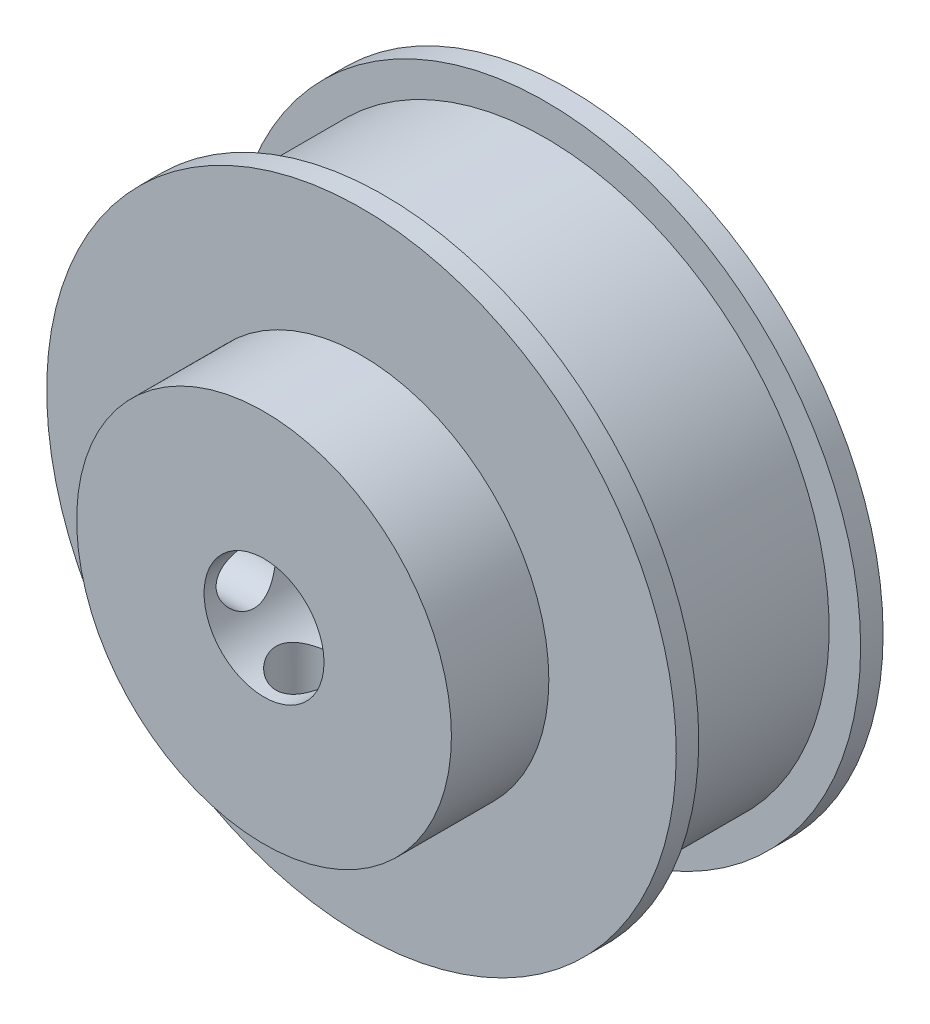
ISO-10303-21;
HEADER;
FILE_DESCRIPTION(('STEP AP214'),'2;1');
FILE_NAME('part.step','',(''),(''),'','','');
FILE_SCHEMA(('AUTOMOTIVE_DESIGN { 1 0 10303 214 1 1 1 1 }'));
ENDSEC;
DATA;
#1=APPLICATION_CONTEXT('core data for automotive mechanical design processes');
#2=APPLICATION_PROTOCOL_DEFINITION('international standard','automotive_design',2000,#1);
#3=PRODUCT_CONTEXT('',#1,'mechanical');
#4=PRODUCT('Part','Part','',(#3));
#5=PRODUCT_RELATED_PRODUCT_CATEGORY('part','',(#4));
#6=PRODUCT_DEFINITION_FORMATION('','',#4);
#7=PRODUCT_DEFINITION_CONTEXT('part definition',#1,'design');
#8=PRODUCT_DEFINITION('design','',#6,#7);
#9=PRODUCT_DEFINITION_SHAPE('','',#8);
#10=(LENGTH_UNIT() NAMED_UNIT(*) SI_UNIT(.MILLI.,.METRE.));
#11=(NAMED_UNIT(*) PLANE_ANGLE_UNIT() SI_UNIT($,.RADIAN.));
#12=(NAMED_UNIT(*) SI_UNIT($,.STERADIAN.) SOLID_ANGLE_UNIT());
#13=UNCERTAINTY_MEASURE_WITH_UNIT(LENGTH_MEASURE(1.E-05),#10,'distance_accuracy_value','');
#14=(GEOMETRIC_REPRESENTATION_CONTEXT(3) GLOBAL_UNCERTAINTY_ASSIGNED_CONTEXT((#13)) GLOBAL_UNIT_ASSIGNED_CONTEXT((#10,
#11,#12)) REPRESENTATION_CONTEXT('',''));
#15=CARTESIAN_POINT('',(0.,0.,0.));
#16=DIRECTION('',(0.,0.,1.));
#17=DIRECTION('',(1.,0.,0.));
#18=AXIS2_PLACEMENT_3D('',#15,#16,#17);
#19=CARTESIAN_POINT('',(0.,0.,13.8));
#20=DIRECTION('',(0.,0.,1.));
#21=DIRECTION('',(1.,0.,0.));
#22=AXIS2_PLACEMENT_3D('',#19,#20,#21);
#23=PLANE('',#22);
#24=CARTESIAN_POINT('',(0.,0.,13.8));
#25=DIRECTION('',(0.,0.,1.));
#26=DIRECTION('',(1.,0.,0.));
#27=AXIS2_PLACEMENT_3D('',#24,#25,#26);
#28=CIRCLE('',#27,21.);
#29=CARTESIAN_POINT('',(21.,0.,13.8));
#30=VERTEX_POINT('',#29);
#31=EDGE_CURVE('E144',#30,#30,#28,.T.);
#32=ORIENTED_EDGE('',*,*,#31,.T.);
#33=EDGE_LOOP('',(#32));
#34=FACE_BOUND('',#33,.T.);
#35=CARTESIAN_POINT('',(0.,0.,13.8));
#36=DIRECTION('',(0.,0.,1.));
#37=DIRECTION('',(1.,0.,0.));
#38=AXIS2_PLACEMENT_3D('',#35,#36,#37);
#39=CIRCLE('',#38,12.5);
#40=CARTESIAN_POINT('',(12.5,0.,13.8));
#41=VERTEX_POINT('',#40);
#42=EDGE_CURVE('E59',#41,#41,#39,.T.);
#43=ORIENTED_EDGE('',*,*,#42,.F.);
#44=EDGE_LOOP('',(#43));
#45=FACE_BOUND('',#44,.T.);
#46=ADVANCED_FACE('F31',(#34,#45),#23,.T.);
#47=CARTESIAN_POINT('',(0.,0.,1.5));
#48=DIRECTION('',(0.,0.,1.));
#49=DIRECTION('',(1.,0.,0.));
#50=AXIS2_PLACEMENT_3D('',#47,#48,#49);
#51=PLANE('',#50);
#52=CARTESIAN_POINT('',(0.,0.,1.5));
#53=DIRECTION('',(0.,0.,1.));
#54=DIRECTION('',(1.,0.,0.));
#55=AXIS2_PLACEMENT_3D('',#52,#53,#54);
#56=CIRCLE('',#55,21.);
#57=CARTESIAN_POINT('',(21.,0.,1.5));
#58=VERTEX_POINT('',#57);
#59=EDGE_CURVE('E10',#58,#58,#56,.T.);
#60=ORIENTED_EDGE('',*,*,#59,.T.);
#61=EDGE_LOOP('',(#60));
#62=FACE_BOUND('',#61,.T.);
#63=CARTESIAN_POINT('',(0.,0.,1.5));
#64=DIRECTION('',(0.,0.,1.));
#65=DIRECTION('',(1.,0.,0.));
#66=AXIS2_PLACEMENT_3D('',#63,#64,#65);
#67=CIRCLE('',#66,18.9);
#68=CARTESIAN_POINT('',(-18.9,0.,1.5));
#69=VERTEX_POINT('',#68);
#70=EDGE_CURVE('E51',#69,#69,#67,.T.);
#71=ORIENTED_EDGE('',*,*,#70,.F.);
#72=EDGE_LOOP('',(#71));
#73=FACE_BOUND('',#72,.T.);
#74=ADVANCED_FACE('F97',(#62,#73),#51,.T.);
#75=CARTESIAN_POINT('',(0.,0.,1.5));
#76=DIRECTION('',(0.,0.,-1.));
#77=DIRECTION('',(-1.,0.,0.));
#78=AXIS2_PLACEMENT_3D('',#75,#76,#77);
#79=CYLINDRICAL_SURFACE('',#78,21.);
#80=ORIENTED_EDGE('',*,*,#59,.F.);
#81=EDGE_LOOP('',(#80));
#82=FACE_BOUND('',#81,.T.);
#83=CARTESIAN_POINT('',(0.,0.,0.));
#84=DIRECTION('',(0.,0.,1.));
#85=DIRECTION('',(1.,0.,0.));
#86=AXIS2_PLACEMENT_3D('',#83,#84,#85);
#87=CIRCLE('',#86,21.);
#88=CARTESIAN_POINT('',(21.,0.,0.));
#89=VERTEX_POINT('',#88);
#90=EDGE_CURVE('E43',#89,#89,#87,.T.);
#91=ORIENTED_EDGE('',*,*,#90,.T.);
#92=EDGE_LOOP('',(#91));
#93=FACE_BOUND('',#92,.T.);
#94=ADVANCED_FACE('F33',(#82,#93),#79,.T.);
#95=CARTESIAN_POINT('',(0.,0.,0.));
#96=DIRECTION('',(0.,0.,1.));
#97=DIRECTION('',(1.,0.,0.));
#98=AXIS2_PLACEMENT_3D('',#95,#96,#97);
#99=PLANE('',#98);
#100=CARTESIAN_POINT('',(0.,0.,0.));
#101=DIRECTION('',(0.,0.,1.));
#102=DIRECTION('',(1.,0.,0.));
#103=AXIS2_PLACEMENT_3D('',#100,#101,#102);
#104=CIRCLE('',#103,4.);
#105=CARTESIAN_POINT('',(4.,0.,0.));
#106=VERTEX_POINT('',#105);
#107=EDGE_CURVE('E127',#106,#106,#104,.T.);
#108=ORIENTED_EDGE('',*,*,#107,.T.);
#109=EDGE_LOOP('',(#108));
#110=FACE_BOUND('',#109,.T.);
#111=ORIENTED_EDGE('',*,*,#90,.F.);
#112=EDGE_LOOP('',(#111));
#113=FACE_BOUND('',#112,.T.);
#114=ADVANCED_FACE('F116',(#110,#113),#99,.F.);
#115=CARTESIAN_POINT('',(0.,0.,12.3));
#116=DIRECTION('',(0.,0.,-1.));
#117=DIRECTION('',(-1.,0.,0.));
#118=AXIS2_PLACEMENT_3D('',#115,#116,#117);
#119=CYLINDRICAL_SURFACE('',#118,18.9);
#120=CARTESIAN_POINT('',(0.,0.,12.3));
#121=DIRECTION('',(0.,0.,1.));
#122=DIRECTION('',(1.,0.,0.));
#123=AXIS2_PLACEMENT_3D('',#120,#121,#122);
#124=CIRCLE('',#123,18.9);
#125=CARTESIAN_POINT('',(-18.9,0.,12.3));
#126=VERTEX_POINT('',#125);
#127=EDGE_CURVE('E48',#126,#126,#124,.T.);
#128=CARTESIAN_POINT('',(-18.9,0.,12.3));
#129=CARTESIAN_POINT('',(-18.9,0.,12.1875));
#130=CARTESIAN_POINT('',(-18.9,0.,12.075));
#131=CARTESIAN_POINT('',(-18.9,0.,11.85));
#132=CARTESIAN_POINT('',(-18.9,0.,11.7375));
#133=CARTESIAN_POINT('',(-18.9,0.,11.5125));
#134=CARTESIAN_POINT('',(-18.9,0.,11.4));
#135=CARTESIAN_POINT('',(-18.9,0.,11.175));
#136=CARTESIAN_POINT('',(-18.9,0.,11.0625));
#137=CARTESIAN_POINT('',(-18.9,0.,10.8375));
#138=CARTESIAN_POINT('',(-18.9,0.,10.725));
#139=CARTESIAN_POINT('',(-18.9,0.,10.5));
#140=CARTESIAN_POINT('',(-18.9,0.,10.3875));
#141=CARTESIAN_POINT('',(-18.9,0.,10.1625));
#142=CARTESIAN_POINT('',(-18.9,0.,10.05));
#143=CARTESIAN_POINT('',(-18.9,0.,9.825));
#144=CARTESIAN_POINT('',(-18.9,0.,9.7125));
#145=CARTESIAN_POINT('',(-18.9,0.,9.4875));
#146=CARTESIAN_POINT('',(-18.9,0.,9.375));
#147=CARTESIAN_POINT('',(-18.9,0.,9.15));
#148=CARTESIAN_POINT('',(-18.9,0.,9.0375));
#149=CARTESIAN_POINT('',(-18.9,0.,8.8125));
#150=CARTESIAN_POINT('',(-18.9,0.,8.7));
#151=CARTESIAN_POINT('',(-18.9,0.,8.475));
#152=CARTESIAN_POINT('',(-18.9,0.,8.3625));
#153=CARTESIAN_POINT('',(-18.9,0.,8.1375));
#154=CARTESIAN_POINT('',(-18.9,0.,8.025));
#155=CARTESIAN_POINT('',(-18.9,0.,7.8));
#156=CARTESIAN_POINT('',(-18.9,0.,7.6875));
#157=CARTESIAN_POINT('',(-18.9,0.,7.4625));
#158=CARTESIAN_POINT('',(-18.9,0.,7.35));
#159=CARTESIAN_POINT('',(-18.9,0.,7.125));
#160=CARTESIAN_POINT('',(-18.9,0.,7.0125));
#161=CARTESIAN_POINT('',(-18.9,0.,6.7875));
#162=CARTESIAN_POINT('',(-18.9,0.,6.675));
#163=CARTESIAN_POINT('',(-18.9,0.,6.45));
#164=CARTESIAN_POINT('',(-18.9,0.,6.3375));
#165=CARTESIAN_POINT('',(-18.9,0.,6.1125));
#166=CARTESIAN_POINT('',(-18.9,0.,6.));
#167=CARTESIAN_POINT('',(-18.9,0.,5.775));
#168=CARTESIAN_POINT('',(-18.9,0.,5.6625));
#169=CARTESIAN_POINT('',(-18.9,0.,5.4375));
#170=CARTESIAN_POINT('',(-18.9,0.,5.325));
#171=CARTESIAN_POINT('',(-18.9,0.,5.1));
#172=CARTESIAN_POINT('',(-18.9,0.,4.9875));
#173=CARTESIAN_POINT('',(-18.9,0.,4.7625));
#174=CARTESIAN_POINT('',(-18.9,0.,4.65));
#175=CARTESIAN_POINT('',(-18.9,0.,4.425));
#176=CARTESIAN_POINT('',(-18.9,0.,4.3125));
#177=CARTESIAN_POINT('',(-18.9,0.,4.0875));
#178=CARTESIAN_POINT('',(-18.9,0.,3.975));
#179=CARTESIAN_POINT('',(-18.9,0.,3.75));
#180=CARTESIAN_POINT('',(-18.9,0.,3.6375));
#181=CARTESIAN_POINT('',(-18.9,0.,3.4125));
#182=CARTESIAN_POINT('',(-18.9,0.,3.3));
#183=CARTESIAN_POINT('',(-18.9,0.,3.075));
#184=CARTESIAN_POINT('',(-18.9,0.,2.9625));
#185=CARTESIAN_POINT('',(-18.9,0.,2.7375));
#186=CARTESIAN_POINT('',(-18.9,0.,2.625));
#187=CARTESIAN_POINT('',(-18.9,0.,2.4));
#188=CARTESIAN_POINT('',(-18.9,0.,2.2875));
#189=CARTESIAN_POINT('',(-18.9,0.,2.0625));
#190=CARTESIAN_POINT('',(-18.9,0.,1.95));
#191=CARTESIAN_POINT('',(-18.9,0.,1.725));
#192=CARTESIAN_POINT('',(-18.9,0.,1.6125));
#193=CARTESIAN_POINT('',(-18.9,0.,1.5));
#194=B_SPLINE_CURVE_WITH_KNOTS('',3,(#128,#129,#130,#131,#132,#133,#134,#135,#136,#137,#138,
#139,#140,#141,#142,#143,#144,#145,#146,#147,#148,#149,#150,#151,#152,#153,#154,#155,#156,#157,
#158,#159,#160,#161,#162,#163,#164,#165,#166,#167,#168,#169,#170,#171,#172,#173,#174,#175,#176,
#177,#178,#179,#180,#181,#182,#183,#184,#185,#186,#187,#188,#189,#190,#191,#192,#193),
.UNSPECIFIED.,.F.,.F.,(4,2,2,2,2,2,2,2,2,2,2,2,2,2,2,2,2,2,2,2,2,2,2,2,2,2,2,2,2,2,2,2,4),(0.,
0.337500000000001,0.675,1.0125,1.35,1.6875,2.025,2.3625,2.7,3.0375,3.375,3.7125,4.05,4.3875,
4.725,5.0625,5.4,5.7375,6.075,6.4125,6.75,7.0875,7.425,7.7625,8.1,8.4375,8.775,9.1125,9.45,
9.7875,10.125,10.4625,10.8),.UNSPECIFIED.);
#195=EDGE_CURVE('BSEAM110',#126,#69,#194,.T.);
#196=ORIENTED_EDGE('',*,*,#127,.F.);
#197=ORIENTED_EDGE('',*,*,#70,.T.);
#198=ORIENTED_EDGE('',*,*,#195,.T.);
#199=ORIENTED_EDGE('',*,*,#195,.F.);
#200=EDGE_LOOP('',(#196,#198,#197,#199));
#201=FACE_BOUND('',#200,.T.);
#202=ADVANCED_FACE('F110',(#201),#119,.T.);
#203=CARTESIAN_POINT('',(0.,0.,12.3));
#204=DIRECTION('',(0.,0.,1.));
#205=DIRECTION('',(1.,0.,0.));
#206=AXIS2_PLACEMENT_3D('',#203,#204,#205);
#207=PLANE('',#206);
#208=CARTESIAN_POINT('',(0.,0.,12.3));
#209=DIRECTION('',(0.,0.,1.));
#210=DIRECTION('',(1.,0.,0.));
#211=AXIS2_PLACEMENT_3D('',#208,#209,#210);
#212=CIRCLE('',#211,21.);
#213=CARTESIAN_POINT('',(21.,0.,12.3));
#214=VERTEX_POINT('',#213);
#215=EDGE_CURVE('E142',#214,#214,#212,.T.);
#216=ORIENTED_EDGE('',*,*,#215,.F.);
#217=EDGE_LOOP('',(#216));
#218=FACE_BOUND('',#217,.T.);
#219=ORIENTED_EDGE('',*,*,#127,.T.);
#220=EDGE_LOOP('',(#219));
#221=FACE_BOUND('',#220,.T.);
#222=ADVANCED_FACE('F106',(#218,#221),#207,.F.);
#223=CARTESIAN_POINT('',(0.,0.,13.8));
#224=DIRECTION('',(0.,0.,-1.));
#225=DIRECTION('',(-1.,0.,0.));
#226=AXIS2_PLACEMENT_3D('',#223,#224,#225);
#227=CYLINDRICAL_SURFACE('',#226,21.);
#228=ORIENTED_EDGE('',*,*,#31,.F.);
#229=EDGE_LOOP('',(#228));
#230=FACE_BOUND('',#229,.T.);
#231=ORIENTED_EDGE('',*,*,#215,.T.);
#232=EDGE_LOOP('',(#231));
#233=FACE_BOUND('',#232,.T.);
#234=ADVANCED_FACE('F109',(#230,#233),#227,.T.);
#235=CARTESIAN_POINT('',(0.,0.,20.3));
#236=DIRECTION('',(0.,0.,-1.));
#237=DIRECTION('',(-1.,0.,0.));
#238=AXIS2_PLACEMENT_3D('',#235,#236,#237);
#239=CYLINDRICAL_SURFACE('',#238,12.5);
#240=CARTESIAN_POINT('',(-12.5,0.,19.5));
#241=CARTESIAN_POINT('',(-12.4999981342099,-0.111577020127934,19.4999954713698));
#242=CARTESIAN_POINT('',(-12.4984904676373,-0.223216523860334,19.4906313927068));
#243=CARTESIAN_POINT('',(-12.4926212341856,-0.443368779658238,19.453435552302));
#244=CARTESIAN_POINT('',(-12.4882569793104,-0.551878486135173,19.4255863960999));
#245=CARTESIAN_POINT('',(-12.4771644640129,-0.762553771126289,19.352279119554));
#246=CARTESIAN_POINT('',(-12.4704380773984,-0.864724302944008,19.3068349538792));
#247=CARTESIAN_POINT('',(-12.4553623980115,-1.05997584434547,19.1996632056022));
#248=CARTESIAN_POINT('',(-12.4470133072085,-1.15305798294893,19.1379376491164));
#249=CARTESIAN_POINT('',(-12.4295364290338,-1.32832749604674,18.9993743957376));
#250=CARTESIAN_POINT('',(-12.4204030044304,-1.41042286652597,18.9224210210548));
#251=CARTESIAN_POINT('',(-12.4024303990938,-1.56059410283783,18.755835532725));
#252=CARTESIAN_POINT('',(-12.393591236265,-1.62866911690709,18.6662026493313));
#253=CARTESIAN_POINT('',(-12.377153335782,-1.74923165413214,18.4761761138479));
#254=CARTESIAN_POINT('',(-12.369561883485,-1.80162899846097,18.3757245626384));
#255=CARTESIAN_POINT('',(-12.3565566594955,-1.88877230962607,18.1673043371312));
#256=CARTESIAN_POINT('',(-12.3511427525034,-1.92351937318009,18.0593361303625));
#257=CARTESIAN_POINT('',(-12.3431614474236,-1.97408758681328,17.8399196231352));
#258=CARTESIAN_POINT('',(-12.3405702530036,-1.990067044504,17.72850868905));
#259=CARTESIAN_POINT('',(-12.3384556715911,-2.00313711337577,17.5045590129146));
#260=CARTESIAN_POINT('',(-12.3389320844424,-2.00022895694193,17.3920203449255));
#261=CARTESIAN_POINT('',(-12.3428771480604,-1.97573547058135,17.1701349695011));
#262=CARTESIAN_POINT('',(-12.3463174079177,-1.95432734726415,17.060768122639));
#263=CARTESIAN_POINT('',(-12.3557581320174,-1.89371943513841,16.847198928902));
#264=CARTESIAN_POINT('',(-12.36175867776,-1.85451907995672,16.7429967465491));
#265=CARTESIAN_POINT('',(-12.375674818266,-1.75925788747207,16.5421807321441));
#266=CARTESIAN_POINT('',(-12.3835988093069,-1.7031228581751,16.4456027003146));
#267=CARTESIAN_POINT('',(-12.4004630811492,-1.57563852632363,16.2631697283147));
#268=CARTESIAN_POINT('',(-12.4094034376511,-1.50428809015537,16.1773155878768));
#269=CARTESIAN_POINT('',(-12.4274181245254,-1.34742984087892,16.0177411995627));
#270=CARTESIAN_POINT('',(-12.4364928200271,-1.26176985545599,15.9441704929312));
#271=CARTESIAN_POINT('',(-12.4536592708467,-1.07924037468053,15.812425261157));
#272=CARTESIAN_POINT('',(-12.4617510207175,-0.982370817216383,15.7542508213299));
#273=CARTESIAN_POINT('',(-12.4760500569944,-0.780035888309123,15.654938321886));
#274=CARTESIAN_POINT('',(-12.4822559575706,-0.674564267421534,15.6138127827311));
#275=CARTESIAN_POINT('',(-12.492072755936,-0.458089833939773,15.549900642074));
#276=CARTESIAN_POINT('',(-12.4956838535962,-0.347087448070732,15.5271126280629));
#277=CARTESIAN_POINT('',(-12.4998774645506,-0.123992055401972,15.500723529987));
#278=CARTESIAN_POINT('',(-12.5004923996757,-0.0119239336604407,15.4969170340423));
#279=CARTESIAN_POINT('',(-12.4987129750933,0.21124937151114,15.5080523816093));
#280=CARTESIAN_POINT('',(-12.4963187218055,0.322354588854285,15.5229935621113));
#281=CARTESIAN_POINT('',(-12.4888100015234,0.539818798235505,15.5710292981892));
#282=CARTESIAN_POINT('',(-12.4837106780256,0.646200674402081,15.6040228253046));
#283=CARTESIAN_POINT('',(-12.4713614614776,0.851922990585993,15.6871194685301));
#284=CARTESIAN_POINT('',(-12.4641114556453,0.95126306099119,15.7372234819381));
#285=CARTESIAN_POINT('',(-12.4481852151843,1.14097865112887,15.8535939993033));
#286=CARTESIAN_POINT('',(-12.4394977755831,1.2312740030957,15.9199896360231));
#287=CARTESIAN_POINT('',(-12.4216959541371,1.39951415639528,16.0668801543625));
#288=CARTESIAN_POINT('',(-12.4125815438834,1.47745813440283,16.1473759751283));
#289=CARTESIAN_POINT('',(-12.3948490273074,1.6195386653,16.321100388104));
#290=CARTESIAN_POINT('',(-12.3862364645378,1.6835368741472,16.4144427787868));
#291=CARTESIAN_POINT('',(-12.3705841030174,1.79494489210119,16.6106737811203));
#292=CARTESIAN_POINT('',(-12.3635442573346,1.84235519623835,16.7135621077771));
#293=CARTESIAN_POINT('',(-12.3518754120478,1.91903158354154,16.9255669592182));
#294=CARTESIAN_POINT('',(-12.3472370587722,1.94836814902516,17.0346574545979));
#295=CARTESIAN_POINT('',(-12.3408723222072,1.98828718554459,17.256297569992));
#296=CARTESIAN_POINT('',(-12.3391457074239,1.99887114748454,17.3688469142908));
#297=CARTESIAN_POINT('',(-12.3388093758569,2.00094546618394,17.5928294934366));
#298=CARTESIAN_POINT('',(-12.3401641282165,1.99265347821446,17.7042607195398));
#299=CARTESIAN_POINT('',(-12.3457602825821,1.95768017972975,17.9241213226272));
#300=CARTESIAN_POINT('',(-12.3500016772787,1.93099891577862,18.0325507072119));
#301=CARTESIAN_POINT('',(-12.3608801586201,1.86008521855063,18.2432553500165));
#302=CARTESIAN_POINT('',(-12.3675148843103,1.81587007770133,18.3455365576413));
#303=CARTESIAN_POINT('',(-12.3824349767408,1.71116577284244,18.5412644676731));
#304=CARTESIAN_POINT('',(-12.3907204147391,1.65067590624507,18.6347107884382));
#305=CARTESIAN_POINT('',(-12.4081216807701,1.51435663599677,18.8112185808365));
#306=CARTESIAN_POINT('',(-12.417245602178,1.43836664580959,18.8941552479004));
#307=CARTESIAN_POINT('',(-12.4352300129975,1.27354334357952,19.0461753813975));
#308=CARTESIAN_POINT('',(-12.44409044097,1.18470706402004,19.1152556381487));
#309=CARTESIAN_POINT('',(-12.4606140562915,0.99604834657733,19.2379974661718));
#310=CARTESIAN_POINT('',(-12.4682693265296,0.896160049794844,19.2915588738874));
#311=CARTESIAN_POINT('',(-12.4814428750468,0.688725166968653,19.3810612928991));
#312=CARTESIAN_POINT('',(-12.4869633156233,0.581186461209752,19.417020143104));
#313=CARTESIAN_POINT('',(-12.4940175589639,0.394335518838039,19.4623457387355));
#314=CARTESIAN_POINT('',(-12.4962491778317,0.316163477498691,19.4764439027928));
#315=CARTESIAN_POINT('',(-12.4992410506714,0.158671480151703,19.4952725728636));
#316=CARTESIAN_POINT('',(-12.5000013269159,0.0793515415388271,19.5000032206792));
#317=CARTESIAN_POINT('',(-12.5,0.,19.5));
#318=B_SPLINE_CURVE_WITH_KNOTS('',3,(#240,#241,#242,#243,#244,#245,#246,#247,#248,#249,#250,
#251,#252,#253,#254,#255,#256,#257,#258,#259,#260,#261,#262,#263,#264,#265,#266,#267,#268,#269,
#270,#271,#272,#273,#274,#275,#276,#277,#278,#279,#280,#281,#282,#283,#284,#285,#286,#287,#288,
#289,#290,#291,#292,#293,#294,#295,#296,#297,#298,#299,#300,#301,#302,#303,#304,#305,#306,#307,
#308,#309,#310,#311,#312,#313,#314,#315,#316,#317),.UNSPECIFIED.,.T.,.F.,(4,2,2,2,2,2,2,2,2,2,2,
2,2,2,2,2,2,2,2,2,2,2,2,2,2,2,2,2,2,2,2,2,2,2,2,2,2,2,4),(0.,0.334441046622945,
0.669197249319467,1.00368849765686,1.33813814029104,1.67523334608234,2.0123490250128,
2.35136809625946,2.69036609964137,3.0264835846965,3.36257913887026,3.695490558905,
4.02841257712192,4.36281487068318,4.69724208737484,5.03548313337389,5.37372605363721,
5.71221693636019,6.05068174320194,6.38547572150114,6.72025786018134,7.05318530227048,
7.38613020622256,7.72180459283845,8.0575013456327,8.39639027086604,8.73526908182521,
9.07281785760314,9.41033979575026,9.74398956846141,10.0776384963298,10.4109591848676,
10.7442942653298,11.0812763085405,11.4183363199473,11.7575256865024,12.0963705940352,
12.3342225666998,12.5720709388195),.UNSPECIFIED.);
#319=CARTESIAN_POINT('',(-12.5,0.,19.5));
#320=VERTEX_POINT('',#319);
#321=EDGE_CURVE('E60',#320,#320,#318,.T.);
#322=ORIENTED_EDGE('',*,*,#321,.T.);
#323=EDGE_LOOP('',(#322));
#324=FACE_BOUND('',#323,.T.);
#325=CARTESIAN_POINT('',(0.,-12.5,19.5));
#326=CARTESIAN_POINT('',(0.111577020127936,-12.4999981342099,19.4999954713698));
#327=CARTESIAN_POINT('',(0.223216523860337,-12.4984904676373,19.4906313927068));
#328=CARTESIAN_POINT('',(0.443368779658241,-12.4926212341856,19.453435552302));
#329=CARTESIAN_POINT('',(0.551878486135176,-12.4882569793104,19.4255863960999));
#330=CARTESIAN_POINT('',(0.762553771126291,-12.4771644640129,19.352279119554));
#331=CARTESIAN_POINT('',(0.86472430294401,-12.4704380773984,19.3068349538792));
#332=CARTESIAN_POINT('',(1.05997584434547,-12.4553623980115,19.1996632056022));
#333=CARTESIAN_POINT('',(1.15305798294894,-12.4470133072085,19.1379376491164));
#334=CARTESIAN_POINT('',(1.32832749604675,-12.4295364290338,18.9993743957376));
#335=CARTESIAN_POINT('',(1.41042286652597,-12.4204030044304,18.9224210210548));
#336=CARTESIAN_POINT('',(1.56059410283783,-12.4024303990938,18.755835532725));
#337=CARTESIAN_POINT('',(1.62866911690709,-12.393591236265,18.6662026493313));
#338=CARTESIAN_POINT('',(1.74923165413214,-12.377153335782,18.4761761138479));
#339=CARTESIAN_POINT('',(1.80162899846097,-12.369561883485,18.3757245626384));
#340=CARTESIAN_POINT('',(1.88877230962607,-12.3565566594955,18.1673043371312));
#341=CARTESIAN_POINT('',(1.92351937318009,-12.3511427525034,18.0593361303625));
#342=CARTESIAN_POINT('',(1.97408758681328,-12.3431614474236,17.8399196231352));
#343=CARTESIAN_POINT('',(1.99006704450401,-12.3405702530036,17.72850868905));
#344=CARTESIAN_POINT('',(2.00313711337577,-12.3384556715911,17.5045590129146));
#345=CARTESIAN_POINT('',(2.00022895694193,-12.3389320844424,17.3920203449255));
#346=CARTESIAN_POINT('',(1.97573547058135,-12.3428771480604,17.1701349695011));
#347=CARTESIAN_POINT('',(1.95432734726415,-12.3463174079177,17.060768122639));
#348=CARTESIAN_POINT('',(1.89371943513841,-12.3557581320174,16.847198928902));
#349=CARTESIAN_POINT('',(1.85451907995672,-12.36175867776,16.7429967465491));
#350=CARTESIAN_POINT('',(1.75925788747207,-12.375674818266,16.5421807321441));
#351=CARTESIAN_POINT('',(1.7031228581751,-12.3835988093069,16.4456027003146));
#352=CARTESIAN_POINT('',(1.57563852632363,-12.4004630811492,16.2631697283147));
#353=CARTESIAN_POINT('',(1.50428809015537,-12.4094034376511,16.1773155878768));
#354=CARTESIAN_POINT('',(1.34742984087892,-12.4274181245254,16.0177411995627));
#355=CARTESIAN_POINT('',(1.26176985545599,-12.4364928200271,15.9441704929312));
#356=CARTESIAN_POINT('',(1.07924037468053,-12.4536592708467,15.812425261157));
#357=CARTESIAN_POINT('',(0.982370817216381,-12.4617510207175,15.7542508213299));
#358=CARTESIAN_POINT('',(0.78003588830912,-12.4760500569944,15.654938321886));
#359=CARTESIAN_POINT('',(0.674564267421531,-12.4822559575706,15.6138127827311));
#360=CARTESIAN_POINT('',(0.45808983393977,-12.492072755936,15.549900642074));
#361=CARTESIAN_POINT('',(0.34708744807073,-12.4956838535962,15.5271126280629));
#362=CARTESIAN_POINT('',(0.123992055401969,-12.4998774645506,15.500723529987));
#363=CARTESIAN_POINT('',(0.0119239336604373,-12.5004923996757,15.4969170340423));
#364=CARTESIAN_POINT('',(-0.211249371511144,-12.4987129750933,15.5080523816093));
#365=CARTESIAN_POINT('',(-0.322354588854289,-12.4963187218055,15.5229935621113));
#366=CARTESIAN_POINT('',(-0.539818798235508,-12.4888100015234,15.5710292981892));
#367=CARTESIAN_POINT('',(-0.646200674402082,-12.4837106780256,15.6040228253046));
#368=CARTESIAN_POINT('',(-0.851922990585995,-12.4713614614776,15.6871194685301));
#369=CARTESIAN_POINT('',(-0.951263060991192,-12.4641114556453,15.7372234819381));
#370=CARTESIAN_POINT('',(-1.14097865112887,-12.4481852151843,15.8535939993033));
#371=CARTESIAN_POINT('',(-1.2312740030957,-12.4394977755831,15.9199896360231));
#372=CARTESIAN_POINT('',(-1.39951415639529,-12.4216959541371,16.0668801543625));
#373=CARTESIAN_POINT('',(-1.47745813440283,-12.4125815438834,16.1473759751283));
#374=CARTESIAN_POINT('',(-1.61953866530001,-12.3948490273074,16.321100388104));
#375=CARTESIAN_POINT('',(-1.6835368741472,-12.3862364645378,16.4144427787868));
#376=CARTESIAN_POINT('',(-1.7949448921012,-12.3705841030174,16.6106737811203));
#377=CARTESIAN_POINT('',(-1.84235519623835,-12.3635442573346,16.7135621077771));
#378=CARTESIAN_POINT('',(-1.91903158354154,-12.3518754120478,16.9255669592182));
#379=CARTESIAN_POINT('',(-1.94836814902516,-12.3472370587722,17.0346574545979));
#380=CARTESIAN_POINT('',(-1.98828718554459,-12.3408723222072,17.256297569992));
#381=CARTESIAN_POINT('',(-1.99887114748454,-12.3391457074239,17.3688469142908));
#382=CARTESIAN_POINT('',(-2.00094546618394,-12.3388093758569,17.5928294934366));
#383=CARTESIAN_POINT('',(-1.99265347821446,-12.3401641282165,17.7042607195398));
#384=CARTESIAN_POINT('',(-1.95768017972975,-12.3457602825821,17.9241213226272));
#385=CARTESIAN_POINT('',(-1.93099891577862,-12.3500016772787,18.0325507072119));
#386=CARTESIAN_POINT('',(-1.86008521855063,-12.3608801586201,18.2432553500165));
#387=CARTESIAN_POINT('',(-1.81587007770133,-12.3675148843103,18.3455365576413));
#388=CARTESIAN_POINT('',(-1.71116577284243,-12.3824349767408,18.5412644676731));
#389=CARTESIAN_POINT('',(-1.65067590624507,-12.3907204147391,18.6347107884382));
#390=CARTESIAN_POINT('',(-1.51435663599676,-12.4081216807701,18.8112185808365));
#391=CARTESIAN_POINT('',(-1.43836664580959,-12.417245602178,18.8941552479004));
#392=CARTESIAN_POINT('',(-1.27354334357952,-12.4352300129975,19.0461753813975));
#393=CARTESIAN_POINT('',(-1.18470706402004,-12.44409044097,19.1152556381487));
#394=CARTESIAN_POINT('',(-0.996048346577327,-12.4606140562915,19.2379974661718));
#395=CARTESIAN_POINT('',(-0.896160049794841,-12.4682693265296,19.2915588738874));
#396=CARTESIAN_POINT('',(-0.68872516696865,-12.4814428750468,19.3810612928991));
#397=CARTESIAN_POINT('',(-0.581186461209748,-12.4869633156233,19.417020143104));
#398=CARTESIAN_POINT('',(-0.394335518838035,-12.4940175589639,19.4623457387355));
#399=CARTESIAN_POINT('',(-0.316163477498688,-12.4962491778317,19.4764439027928));
#400=CARTESIAN_POINT('',(-0.158671480151701,-12.4992410506714,19.4952725728636));
#401=CARTESIAN_POINT('',(-0.079351541538825,-12.5000013269159,19.5000032206792));
#402=CARTESIAN_POINT('',(0.,-12.5,19.5));
#403=B_SPLINE_CURVE_WITH_KNOTS('',3,(#325,#326,#327,#328,#329,#330,#331,#332,#333,#334,#335,
#336,#337,#338,#339,#340,#341,#342,#343,#344,#345,#346,#347,#348,#349,#350,#351,#352,#353,#354,
#355,#356,#357,#358,#359,#360,#361,#362,#363,#364,#365,#366,#367,#368,#369,#370,#371,#372,#373,
#374,#375,#376,#377,#378,#379,#380,#381,#382,#383,#384,#385,#386,#387,#388,#389,#390,#391,#392,
#393,#394,#395,#396,#397,#398,#399,#400,#401,#402),.UNSPECIFIED.,.T.,.F.,(4,2,2,2,2,2,2,2,2,2,2,
2,2,2,2,2,2,2,2,2,2,2,2,2,2,2,2,2,2,2,2,2,2,2,2,2,2,2,4),(0.,0.334441046622945,
0.669197249319468,1.00368849765686,1.33813814029104,1.67523334608234,2.0123490250128,
2.35136809625945,2.69036609964138,3.0264835846965,3.36257913887026,3.695490558905,
4.02841257712193,4.36281487068318,4.69724208737484,5.0354831333739,5.37372605363722,
5.71221693636019,6.05068174320195,6.38547572150115,6.72025786018135,7.05318530227048,
7.38613020622257,7.72180459283845,8.05750134563271,8.39639027086604,8.73526908182521,
9.07281785760315,9.41033979575028,9.74398956846142,10.0776384963298,10.4109591848676,
10.7442942653299,11.0812763085405,11.4183363199474,11.7575256865024,12.0963705940352,
12.3342225666999,12.5720709388195),.UNSPECIFIED.);
#404=CARTESIAN_POINT('',(0.,-12.5,19.5));
#405=VERTEX_POINT('',#404);
#406=EDGE_CURVE('E53',#405,#405,#403,.T.);
#407=ORIENTED_EDGE('',*,*,#406,.T.);
#408=EDGE_LOOP('',(#407));
#409=FACE_BOUND('',#408,.T.);
#410=CARTESIAN_POINT('',(0.,0.,20.3));
#411=DIRECTION('',(0.,0.,1.));
#412=DIRECTION('',(1.,0.,0.));
#413=AXIS2_PLACEMENT_3D('',#410,#411,#412);
#414=CIRCLE('',#413,12.5);
#415=CARTESIAN_POINT('',(12.5,0.,20.3));
#416=VERTEX_POINT('',#415);
#417=EDGE_CURVE('E140',#416,#416,#414,.T.);
#418=ORIENTED_EDGE('',*,*,#417,.F.);
#419=EDGE_LOOP('',(#418));
#420=FACE_BOUND('',#419,.T.);
#421=ORIENTED_EDGE('',*,*,#42,.T.);
#422=EDGE_LOOP('',(#421));
#423=FACE_BOUND('',#422,.T.);
#424=ADVANCED_FACE('F61',(#324,#409,#420,#423),#239,.T.);
#425=CARTESIAN_POINT('',(0.,0.,20.3));
#426=DIRECTION('',(0.,0.,1.));
#427=DIRECTION('',(1.,0.,0.));
#428=AXIS2_PLACEMENT_3D('',#425,#426,#427);
#429=PLANE('',#428);
#430=CARTESIAN_POINT('',(0.,0.,20.3));
#431=DIRECTION('',(0.,0.,1.));
#432=DIRECTION('',(1.,0.,0.));
#433=AXIS2_PLACEMENT_3D('',#430,#431,#432);
#434=CIRCLE('',#433,4.);
#435=CARTESIAN_POINT('',(4.,0.,20.3));
#436=VERTEX_POINT('',#435);
#437=EDGE_CURVE('E80',#436,#436,#434,.T.);
#438=ORIENTED_EDGE('',*,*,#437,.F.);
#439=EDGE_LOOP('',(#438));
#440=FACE_BOUND('',#439,.T.);
#441=ORIENTED_EDGE('',*,*,#417,.T.);
#442=EDGE_LOOP('',(#441));
#443=FACE_BOUND('',#442,.T.);
#444=ADVANCED_FACE('F69',(#440,#443),#429,.T.);
#445=CARTESIAN_POINT('',(0.,-21.,17.5));
#446=DIRECTION('',(0.,1.,0.));
#447=DIRECTION('',(0.,0.,1.));
#448=AXIS2_PLACEMENT_3D('',#445,#446,#447);
#449=CYLINDRICAL_SURFACE('',#448,2.);
#450=CARTESIAN_POINT('',(0.,-4.,19.5));
#451=CARTESIAN_POINT('',(0.105143925902469,-3.99999426810083,19.4999933953656));
#452=CARTESIAN_POINT('',(0.210413199395127,-3.99580982039513,19.4916598537579));
#453=CARTESIAN_POINT('',(0.417840470537794,-3.97948312074314,19.4586942393169));
#454=CARTESIAN_POINT('',(0.519992173427261,-3.96732575657839,19.4340312140044));
#455=CARTESIAN_POINT('',(0.7178670897609,-3.93632558806751,19.3696123827667));
#456=CARTESIAN_POINT('',(0.813613605878294,-3.91750878355075,19.3299152315041));
#457=CARTESIAN_POINT('',(0.9969452336132,-3.87491553031523,19.23685875727));
#458=CARTESIAN_POINT('',(1.08453098798012,-3.8511394726705,19.1835005115023));
#459=CARTESIAN_POINT('',(1.25501563552382,-3.79912516516124,19.0609655010294));
#460=CARTESIAN_POINT('',(1.33731042224422,-3.77070398255074,18.9910270415207));
#461=CARTESIAN_POINT('',(1.48955888973396,-3.71319940493486,18.8389570415059));
#462=CARTESIAN_POINT('',(1.55950316621354,-3.68411552418069,18.7568162964551));
#463=CARTESIAN_POINT('',(1.69050400090056,-3.62597902394695,18.5750333009532));
#464=CARTESIAN_POINT('',(1.75045067110328,-3.59710373940264,18.4745278033082));
#465=CARTESIAN_POINT('',(1.85233645378139,-3.54571957544641,18.2632653280276));
#466=CARTESIAN_POINT('',(1.89428842993267,-3.52320615213979,18.1525157425545));
#467=CARTESIAN_POINT('',(1.95626488437718,-3.48915734075617,17.9306697891562));
#468=CARTESIAN_POINT('',(1.97745171416089,-3.47704543167427,17.8199910958652));
#469=CARTESIAN_POINT('',(2.00085398661769,-3.46363779897055,17.596042324441));
#470=CARTESIAN_POINT('',(2.00308817674615,-3.46233138686576,17.4827749182577));
#471=CARTESIAN_POINT('',(1.98937457434459,-3.47021860514497,17.2714279513693));
#472=CARTESIAN_POINT('',(1.97556911907365,-3.47817527324027,17.1731519375539));
#473=CARTESIAN_POINT('',(1.93387969811387,-3.501524574677,16.9805561812539));
#474=CARTESIAN_POINT('',(1.90599124779531,-3.51691957663552,16.8862377093894));
#475=CARTESIAN_POINT('',(1.83641956077201,-3.55374952825482,16.7015417348687));
#476=CARTESIAN_POINT('',(1.79443013423199,-3.57531681327997,16.6113072024284));
#477=CARTESIAN_POINT('',(1.69808337533601,-3.62206808562807,16.43873141482));
#478=CARTESIAN_POINT('',(1.64372048762494,-3.64725369560381,16.3563937287998));
#479=CARTESIAN_POINT('',(1.51613210982558,-3.70226315806571,16.1909574945136));
#480=CARTESIAN_POINT('',(1.44138891673857,-3.73227020473492,16.1090862528477));
#481=CARTESIAN_POINT('',(1.27911115748275,-3.79095246600814,15.9585291628182));
#482=CARTESIAN_POINT('',(1.19157051314857,-3.81962703917602,15.8898496159322));
#483=CARTESIAN_POINT('',(1.0010330116637,-3.87403974565928,15.7646286779405));
#484=CARTESIAN_POINT('',(0.897507183198821,-3.89957968324014,15.7087990551085));
#485=CARTESIAN_POINT('',(0.680932430977596,-3.94315762242485,15.615805941914));
#486=CARTESIAN_POINT('',(0.567891152530554,-3.96120157887106,15.5786276299697));
#487=CARTESIAN_POINT('',(0.345532983321407,-3.98648667482871,15.5270491925666));
#488=CARTESIAN_POINT('',(0.236683061096655,-3.9944987660262,15.5110175285064));
#489=CARTESIAN_POINT('',(0.0175591998987058,-4.00146026918207,15.497070537731));
#490=CARTESIAN_POINT('',(-0.0927140397398147,-4.00041397442637,15.4991466287211));
#491=CARTESIAN_POINT('',(-0.302465943971971,-3.9898238450687,15.5204133768375));
#492=CARTESIAN_POINT('',(-0.402118816099857,-3.98094491376337,15.53826506546));
#493=CARTESIAN_POINT('',(-0.596813784603879,-3.9564434262968,15.5884761437902));
#494=CARTESIAN_POINT('',(-0.69185537138217,-3.94082012668824,15.620837132907));
#495=CARTESIAN_POINT('',(-0.877777216899141,-3.90368502827176,15.6999969328661));
#496=CARTESIAN_POINT('',(-0.968460794011602,-3.88201763539262,15.7471821002326));
#497=CARTESIAN_POINT('',(-1.14092272339854,-3.83487948634835,15.8542150712931));
#498=CARTESIAN_POINT('',(-1.22269725955318,-3.80940711133877,15.9140682691908));
#499=CARTESIAN_POINT('',(-1.38353537857843,-3.75416442672396,16.0515208506614));
#500=CARTESIAN_POINT('',(-1.46154415563805,-3.72421769686999,16.1302857368903));
#501=CARTESIAN_POINT('',(-1.60371264223771,-3.6652478321764,16.2998503025555));
#502=CARTESIAN_POINT('',(-1.66786277142374,-3.63622534800094,16.3906582376958));
#503=CARTESIAN_POINT('',(-1.78341582895803,-3.58102384412979,16.5872873083459));
#504=CARTESIAN_POINT('',(-1.83405099160049,-3.55505059178122,16.693622532189));
#505=CARTESIAN_POINT('',(-1.91616565186941,-3.5114814458827,16.9150201351499));
#506=CARTESIAN_POINT('',(-1.94766983173403,-3.493874764435,17.0300710529338));
#507=CARTESIAN_POINT('',(-1.98772337493374,-3.47123002051604,17.2538204457694));
#508=CARTESIAN_POINT('',(-1.9981859928109,-3.4651476693013,17.3620685068705));
#509=CARTESIAN_POINT('',(-2.0013783087524,-3.46330709283207,17.5788941343291));
#510=CARTESIAN_POINT('',(-1.99411569324648,-3.4675443925278,17.6874715374757));
#511=CARTESIAN_POINT('',(-1.96385225118662,-3.48475724102153,17.8909670030669));
#512=CARTESIAN_POINT('',(-1.94241662868606,-3.49686188965317,17.9862009402895));
#513=CARTESIAN_POINT('',(-1.88635071644882,-3.52742032375305,18.1716162388487));
#514=CARTESIAN_POINT('',(-1.85171618231984,-3.54587615139337,18.2617959641841));
#515=CARTESIAN_POINT('',(-1.76763149060113,-3.58857060729071,18.4412497019731));
#516=CARTESIAN_POINT('',(-1.7173422756314,-3.61311444791841,18.5300558036581));
#517=CARTESIAN_POINT('',(-1.60430194327478,-3.66470663269721,18.6985490723625));
#518=CARTESIAN_POINT('',(-1.54154434248312,-3.69175627591221,18.7782314610422));
#519=CARTESIAN_POINT('',(-1.39640665332275,-3.74924646316184,18.9362839647094));
#520=CARTESIAN_POINT('',(-1.31256884599452,-3.77969966613256,19.0133182047006));
#521=CARTESIAN_POINT('',(-1.13230961246639,-3.83755504519862,19.1525259668705));
#522=CARTESIAN_POINT('',(-1.03588144661039,-3.8649555725239,19.2146914789398));
#523=CARTESIAN_POINT('',(-0.831863193565887,-3.91396019133075,19.3224727254241));
#524=CARTESIAN_POINT('',(-0.724199007553457,-3.93552192987866,19.3679683384729));
#525=CARTESIAN_POINT('',(-0.501484202276169,-3.97002682597974,19.4396163355148));
#526=CARTESIAN_POINT('',(-0.386455599178195,-3.98299446726136,19.4658236936114));
#527=CARTESIAN_POINT('',(-0.225203892981786,-3.99390923826956,19.4877948221715));
#528=CARTESIAN_POINT('',(-0.180323758883126,-3.99618730680502,19.4923652817327));
#529=CARTESIAN_POINT('',(-0.0903034636101808,-3.99923393953631,19.4984693310282));
#530=CARTESIAN_POINT('',(-0.0451632952932546,-4.00000246206762,19.5000028369404));
#531=CARTESIAN_POINT('',(0.,-4.,19.5));
#532=B_SPLINE_CURVE_WITH_KNOTS('',3,(#450,#451,#452,#453,#454,#455,#456,#457,#458,#459,#460,
#461,#462,#463,#464,#465,#466,#467,#468,#469,#470,#471,#472,#473,#474,#475,#476,#477,#478,#479,
#480,#481,#482,#483,#484,#485,#486,#487,#488,#489,#490,#491,#492,#493,#494,#495,#496,#497,#498,
#499,#500,#501,#502,#503,#504,#505,#506,#507,#508,#509,#510,#511,#512,#513,#514,#515,#516,#517,
#518,#519,#520,#521,#522,#523,#524,#525,#526,#527,#528,#529,#530,#531),.UNSPECIFIED.,.T.,.F.,(4,
2,2,2,2,2,2,2,2,2,2,2,2,2,2,2,2,2,2,2,2,2,2,2,2,2,2,2,2,2,2,2,2,2,2,2,2,2,2,2,4),(0.,
0.315248514840585,0.631096299418395,0.945724310984597,1.26032752116313,1.59396351743618,
1.92785247530807,2.28763452861505,2.64715895796562,2.98516024280459,3.32282714658041,
3.62011424818641,3.91749607851357,4.22180480336975,4.52625042520444,4.86929882667757,
5.21251069197373,5.57166044428882,5.93052433824559,6.25966580942692,6.58865129022952,
6.89213813012244,7.19565843261863,7.50785712055797,7.82018901496678,8.16319221288838,
8.50643177230864,8.86629364323451,9.22569023890901,9.55058615006093,9.87534119729357,
10.1691586049771,10.463070575767,10.7767291356057,11.0905512228726,11.4425048551434,
11.7946476676249,12.1492802732705,12.502898172423,12.6383056026783,12.7737167702213),.UNSPECIFIED.);
#533=CARTESIAN_POINT('',(0.,-4.,19.5));
#534=VERTEX_POINT('',#533);
#535=EDGE_CURVE('E74',#534,#534,#532,.T.);
#536=ORIENTED_EDGE('',*,*,#535,.T.);
#537=EDGE_LOOP('',(#536));
#538=FACE_BOUND('',#537,.T.);
#539=ORIENTED_EDGE('',*,*,#406,.F.);
#540=EDGE_LOOP('',(#539));
#541=FACE_BOUND('',#540,.T.);
#542=ADVANCED_FACE('F65',(#538,#541),#449,.F.);
#543=CARTESIAN_POINT('',(-21.,0.,17.5));
#544=DIRECTION('',(1.,0.,0.));
#545=DIRECTION('',(0.,0.,-1.));
#546=AXIS2_PLACEMENT_3D('',#543,#544,#545);
#547=CYLINDRICAL_SURFACE('',#546,2.);
#548=CARTESIAN_POINT('',(-4.,0.,15.5));
#549=CARTESIAN_POINT('',(-3.99999426810083,0.105143925902464,15.5000066046344));
#550=CARTESIAN_POINT('',(-3.99580982039513,0.210413199395122,15.5083401462421));
#551=CARTESIAN_POINT('',(-3.97948312074314,0.417840470537789,15.5413057606831));
#552=CARTESIAN_POINT('',(-3.96732575657839,0.519992173427255,15.5659687859956));
#553=CARTESIAN_POINT('',(-3.93632558806751,0.717867089760894,15.6303876172333));
#554=CARTESIAN_POINT('',(-3.91750878355075,0.813613605878289,15.6700847684959));
#555=CARTESIAN_POINT('',(-3.87491553031523,0.996945233613193,15.76314124273));
#556=CARTESIAN_POINT('',(-3.85113947267051,1.08453098798011,15.8164994884977));
#557=CARTESIAN_POINT('',(-3.79912516516124,1.25501563552381,15.9390344989706));
#558=CARTESIAN_POINT('',(-3.77070398255075,1.33731042224421,16.0089729584793));
#559=CARTESIAN_POINT('',(-3.71319940493486,1.48955888973395,16.1610429584941));
#560=CARTESIAN_POINT('',(-3.6841155241807,1.55950316621353,16.2431837035449));
#561=CARTESIAN_POINT('',(-3.62597902394695,1.69050400090055,16.4249666990468));
#562=CARTESIAN_POINT('',(-3.59710373940264,1.75045067110327,16.5254721966918));
#563=CARTESIAN_POINT('',(-3.54571957544641,1.85233645378139,16.7367346719724));
#564=CARTESIAN_POINT('',(-3.52320615213979,1.89428842993266,16.8474842574455));
#565=CARTESIAN_POINT('',(-3.48915734075617,1.95626488437717,17.0693302108438));
#566=CARTESIAN_POINT('',(-3.47704543167427,1.97745171416088,17.1800089041348));
#567=CARTESIAN_POINT('',(-3.46363779897055,2.00085398661769,17.403957675559));
#568=CARTESIAN_POINT('',(-3.46233138686576,2.00308817674615,17.5172250817423));
#569=CARTESIAN_POINT('',(-3.47021860514497,1.98937457434459,17.7285720486307));
#570=CARTESIAN_POINT('',(-3.47817527324027,1.97556911907364,17.8268480624461));
#571=CARTESIAN_POINT('',(-3.50152457467701,1.93387969811386,18.0194438187461));
#572=CARTESIAN_POINT('',(-3.51691957663553,1.9059912477953,18.1137622906106));
#573=CARTESIAN_POINT('',(-3.55374952825482,1.836419560772,18.2984582651313));
#574=CARTESIAN_POINT('',(-3.57531681327997,1.79443013423199,18.3886927975716));
#575=CARTESIAN_POINT('',(-3.62206808562807,1.698083375336,18.56126858518));
#576=CARTESIAN_POINT('',(-3.64725369560381,1.64372048762493,18.6436062712002));
#577=CARTESIAN_POINT('',(-3.70226315806572,1.51613210982557,18.8090425054865));
#578=CARTESIAN_POINT('',(-3.73227020473492,1.44138891673856,18.8909137471523));
#579=CARTESIAN_POINT('',(-3.79095246600815,1.27911115748274,19.0414708371818));
#580=CARTESIAN_POINT('',(-3.81962703917602,1.19157051314857,19.1101503840678));
#581=CARTESIAN_POINT('',(-3.87403974565928,1.00103301166369,19.2353713220595));
#582=CARTESIAN_POINT('',(-3.89957968324015,0.897507183198814,19.2912009448915));
#583=CARTESIAN_POINT('',(-3.94315762242485,0.68093243097759,19.384194058086));
#584=CARTESIAN_POINT('',(-3.96120157887106,0.567891152530548,19.4213723700303));
#585=CARTESIAN_POINT('',(-3.98648667482871,0.345532983321402,19.4729508074334));
#586=CARTESIAN_POINT('',(-3.9944987660262,0.23668306109665,19.4889824714936));
#587=CARTESIAN_POINT('',(-4.00146026918207,0.0175591998987017,19.502929462269));
#588=CARTESIAN_POINT('',(-4.00041397442637,-0.092714039739819,19.5008533712789));
#589=CARTESIAN_POINT('',(-3.9898238450687,-0.302465943971975,19.4795866231625));
#590=CARTESIAN_POINT('',(-3.98094491376337,-0.402118816099861,19.46173493454));
#591=CARTESIAN_POINT('',(-3.9564434262968,-0.596813784603883,19.4115238562098));
#592=CARTESIAN_POINT('',(-3.94082012668824,-0.691855371382174,19.379162867093));
#593=CARTESIAN_POINT('',(-3.90368502827176,-0.877777216899146,19.3000030671339));
#594=CARTESIAN_POINT('',(-3.88201763539262,-0.968460794011607,19.2528178997674));
#595=CARTESIAN_POINT('',(-3.83487948634835,-1.14092272339854,19.1457849287069));
#596=CARTESIAN_POINT('',(-3.80940711133877,-1.22269725955318,19.0859317308092));
#597=CARTESIAN_POINT('',(-3.75416442672396,-1.38353537857843,18.9484791493386));
#598=CARTESIAN_POINT('',(-3.72421769686998,-1.46154415563805,18.8697142631097));
#599=CARTESIAN_POINT('',(-3.6652478321764,-1.60371264223771,18.7001496974445));
#600=CARTESIAN_POINT('',(-3.63622534800094,-1.66786277142375,18.6093417623042));
#601=CARTESIAN_POINT('',(-3.58102384412979,-1.78341582895804,18.4127126916541));
#602=CARTESIAN_POINT('',(-3.55505059178121,-1.8340509916005,18.306377467811));
#603=CARTESIAN_POINT('',(-3.51148144588269,-1.91616565186941,18.0849798648501));
#604=CARTESIAN_POINT('',(-3.493874764435,-1.94766983173403,17.9699289470662));
#605=CARTESIAN_POINT('',(-3.47123002051604,-1.98772337493375,17.7461795542306));
#606=CARTESIAN_POINT('',(-3.4651476693013,-1.99818599281091,17.6379314931295));
#607=CARTESIAN_POINT('',(-3.46330709283206,-2.00137830875241,17.421105865671));
#608=CARTESIAN_POINT('',(-3.4675443925278,-1.99411569324649,17.3125284625243));
#609=CARTESIAN_POINT('',(-3.48475724102153,-1.96385225118662,17.1090329969331));
#610=CARTESIAN_POINT('',(-3.49686188965317,-1.94241662868607,17.0137990597105));
#611=CARTESIAN_POINT('',(-3.52742032375305,-1.88635071644883,16.8283837611513));
#612=CARTESIAN_POINT('',(-3.54587615139337,-1.85171618231985,16.7382040358159));
#613=CARTESIAN_POINT('',(-3.58857060729071,-1.76763149060113,16.5587502980269));
#614=CARTESIAN_POINT('',(-3.61311444791841,-1.7173422756314,16.4699441963419));
#615=CARTESIAN_POINT('',(-3.66470663269721,-1.60430194327479,16.3014509276375));
#616=CARTESIAN_POINT('',(-3.69175627591221,-1.54154434248313,16.2217685389578));
#617=CARTESIAN_POINT('',(-3.74924646316184,-1.39640665332275,16.0637160352906));
#618=CARTESIAN_POINT('',(-3.77969966613256,-1.31256884599452,15.9866817952994));
#619=CARTESIAN_POINT('',(-3.83755504519861,-1.1323096124664,15.8474740331295));
#620=CARTESIAN_POINT('',(-3.8649555725239,-1.0358814466104,15.7853085210602));
#621=CARTESIAN_POINT('',(-3.91396019133075,-0.831863193565894,15.6775272745759));
#622=CARTESIAN_POINT('',(-3.93552192987866,-0.724199007553463,15.6320316615271));
#623=CARTESIAN_POINT('',(-3.97002682597974,-0.501484202276175,15.5603836644852));
#624=CARTESIAN_POINT('',(-3.98299446726136,-0.386455599178202,15.5341763063886));
#625=CARTESIAN_POINT('',(-3.99390923826956,-0.225203892981792,15.5122051778285));
#626=CARTESIAN_POINT('',(-3.99618730680502,-0.180323758883132,15.5076347182673));
#627=CARTESIAN_POINT('',(-3.99923393953631,-0.0903034636101852,15.5015306689718));
#628=CARTESIAN_POINT('',(-4.00000246206762,-0.0451632952932589,15.4999971630596));
#629=CARTESIAN_POINT('',(-4.,0.,15.5));
#630=B_SPLINE_CURVE_WITH_KNOTS('',3,(#548,#549,#550,#551,#552,#553,#554,#555,#556,#557,#558,
#559,#560,#561,#562,#563,#564,#565,#566,#567,#568,#569,#570,#571,#572,#573,#574,#575,#576,#577,
#578,#579,#580,#581,#582,#583,#584,#585,#586,#587,#588,#589,#590,#591,#592,#593,#594,#595,#596,
#597,#598,#599,#600,#601,#602,#603,#604,#605,#606,#607,#608,#609,#610,#611,#612,#613,#614,#615,
#616,#617,#618,#619,#620,#621,#622,#623,#624,#625,#626,#627,#628,#629),.UNSPECIFIED.,.T.,.F.,(4,
2,2,2,2,2,2,2,2,2,2,2,2,2,2,2,2,2,2,2,2,2,2,2,2,2,2,2,2,2,2,2,2,2,2,2,2,2,2,2,4),(0.,
0.315248514840584,0.631096299418394,0.945724310984595,1.26032752116313,1.59396351743618,
1.92785247530807,2.28763452861504,2.64715895796561,2.98516024280459,3.32282714658041,
3.62011424818641,3.91749607851357,4.22180480336974,4.52625042520443,4.86929882667757,
5.21251069197373,5.57166044428881,5.93052433824559,6.25966580942691,6.58865129022952,
6.89213813012244,7.19565843261863,7.50785712055797,7.82018901496678,8.16319221288837,
8.50643177230863,8.86629364323451,9.22569023890901,9.55058615006093,9.87534119729357,
10.1691586049771,10.463070575767,10.7767291356057,11.0905512228726,11.4425048551434,
11.7946476676249,12.1492802732705,12.502898172423,12.6383056026783,12.7737167702213),.UNSPECIFIED.);
#631=CARTESIAN_POINT('',(-4.,0.,15.5));
#632=VERTEX_POINT('',#631);
#633=EDGE_CURVE('E35',#632,#632,#630,.T.);
#634=ORIENTED_EDGE('',*,*,#633,.T.);
#635=EDGE_LOOP('',(#634));
#636=FACE_BOUND('',#635,.T.);
#637=ORIENTED_EDGE('',*,*,#321,.F.);
#638=EDGE_LOOP('',(#637));
#639=FACE_BOUND('',#638,.T.);
#640=ADVANCED_FACE('F68',(#636,#639),#547,.F.);
#641=CARTESIAN_POINT('',(0.,0.,0.));
#642=DIRECTION('',(0.,0.,1.));
#643=DIRECTION('',(1.,0.,0.));
#644=AXIS2_PLACEMENT_3D('',#641,#642,#643);
#645=CYLINDRICAL_SURFACE('',#644,4.);
#646=ORIENTED_EDGE('',*,*,#633,.F.);
#647=EDGE_LOOP('',(#646));
#648=FACE_BOUND('',#647,.T.);
#649=ORIENTED_EDGE('',*,*,#107,.F.);
#650=EDGE_LOOP('',(#649));
#651=FACE_BOUND('',#650,.T.);
#652=ORIENTED_EDGE('',*,*,#437,.T.);
#653=EDGE_LOOP('',(#652));
#654=FACE_BOUND('',#653,.T.);
#655=ORIENTED_EDGE('',*,*,#535,.F.);
#656=EDGE_LOOP('',(#655));
#657=FACE_BOUND('',#656,.T.);
#658=ADVANCED_FACE('F85',(#648,#651,#654,#657),#645,.F.);
#659=CLOSED_SHELL('',(#46,#74,#94,#114,#202,#222,#234,#424,#444,#542,#640,#658));
#660=MANIFOLD_SOLID_BREP('B2',#659);
#661=ADVANCED_BREP_SHAPE_REPRESENTATION('',(#18,#660),#14);
#662=SHAPE_DEFINITION_REPRESENTATION(#9,#661);
ENDSEC;
END-ISO-10303-21;
